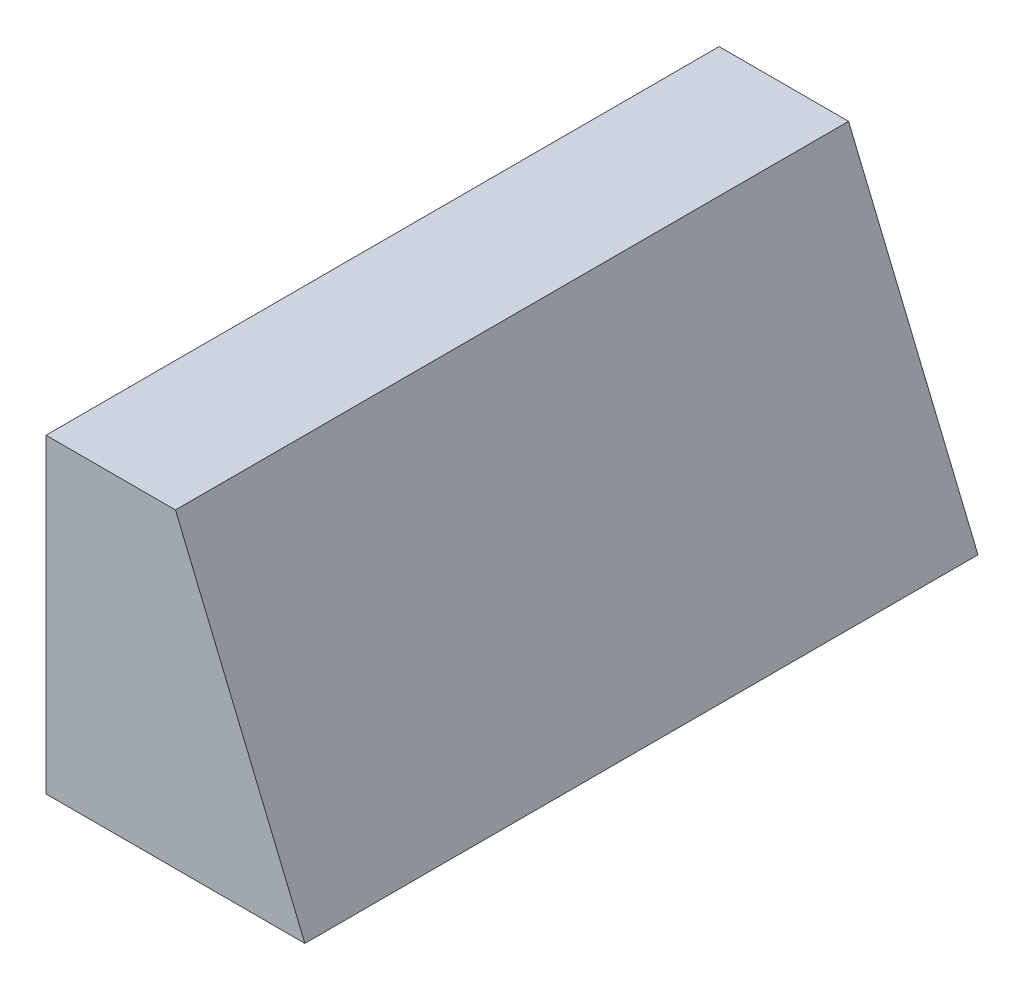
ISO-10303-21;
HEADER;
FILE_DESCRIPTION(('STEP AP214'),'2;1');
FILE_NAME('part.step','',(''),(''),'','','');
FILE_SCHEMA(('AUTOMOTIVE_DESIGN { 1 0 10303 214 1 1 1 1 }'));
ENDSEC;
DATA;
#1=APPLICATION_CONTEXT('core data for automotive mechanical design processes');
#2=APPLICATION_PROTOCOL_DEFINITION('international standard','automotive_design',2000,#1);
#3=PRODUCT_CONTEXT('',#1,'mechanical');
#4=PRODUCT('Part','Part','',(#3));
#5=PRODUCT_RELATED_PRODUCT_CATEGORY('part','',(#4));
#6=PRODUCT_DEFINITION_FORMATION('','',#4);
#7=PRODUCT_DEFINITION_CONTEXT('part definition',#1,'design');
#8=PRODUCT_DEFINITION('design','',#6,#7);
#9=PRODUCT_DEFINITION_SHAPE('','',#8);
#10=(LENGTH_UNIT() NAMED_UNIT(*) SI_UNIT(.MILLI.,.METRE.));
#11=(NAMED_UNIT(*) PLANE_ANGLE_UNIT() SI_UNIT($,.RADIAN.));
#12=(NAMED_UNIT(*) SI_UNIT($,.STERADIAN.) SOLID_ANGLE_UNIT());
#13=UNCERTAINTY_MEASURE_WITH_UNIT(LENGTH_MEASURE(1.E-05),#10,'distance_accuracy_value','');
#14=(GEOMETRIC_REPRESENTATION_CONTEXT(3) GLOBAL_UNCERTAINTY_ASSIGNED_CONTEXT((#13)) GLOBAL_UNIT_ASSIGNED_CONTEXT((#10,
#11,#12)) REPRESENTATION_CONTEXT('',''));
#15=CARTESIAN_POINT('',(0.,0.,0.));
#16=DIRECTION('',(0.,0.,1.));
#17=DIRECTION('',(1.,0.,0.));
#18=AXIS2_PLACEMENT_3D('',#15,#16,#17);
#19=CARTESIAN_POINT('',(-5.3851590106007,5.40636042402827,26.));
#20=DIRECTION('',(0.,-1.,0.));
#21=DIRECTION('',(0.,0.,-1.));
#22=AXIS2_PLACEMENT_3D('',#19,#20,#21);
#23=PLANE('',#22);
#24=DIRECTION('',(-1.,0.,0.));
#25=VECTOR('',#24,1.);
#26=CARTESIAN_POINT('',(-5.3851590106007,5.40636042402827,0.));
#27=LINE('',#26,#25);
#28=CARTESIAN_POINT('',(-0.385159010600699,5.40636042402827,0.));
#29=VERTEX_POINT('',#28);
#30=CARTESIAN_POINT('',(-5.3851590106007,5.40636042402827,0.));
#31=VERTEX_POINT('',#30);
#32=EDGE_CURVE('E97',#29,#31,#27,.T.);
#33=ORIENTED_EDGE('',*,*,#32,.T.);
#34=DIRECTION('',(0.,0.,-1.));
#35=VECTOR('',#34,1.);
#36=CARTESIAN_POINT('',(-5.3851590106007,5.40636042402827,26.));
#37=LINE('',#36,#35);
#38=CARTESIAN_POINT('',(-5.3851590106007,5.40636042402827,26.));
#39=VERTEX_POINT('',#38);
#40=EDGE_CURVE('E11',#39,#31,#37,.T.);
#41=ORIENTED_EDGE('',*,*,#40,.F.);
#42=DIRECTION('',(-1.,0.,0.));
#43=VECTOR('',#42,1.);
#44=CARTESIAN_POINT('',(-5.3851590106007,5.40636042402827,26.));
#45=LINE('',#44,#43);
#46=CARTESIAN_POINT('',(-0.385159010600699,5.40636042402827,26.));
#47=VERTEX_POINT('',#46);
#48=EDGE_CURVE('E85',#47,#39,#45,.T.);
#49=ORIENTED_EDGE('',*,*,#48,.F.);
#50=DIRECTION('',(0.,0.,-1.));
#51=VECTOR('',#50,1.);
#52=CARTESIAN_POINT('',(-0.385159010600699,5.40636042402827,26.));
#53=LINE('',#52,#51);
#54=EDGE_CURVE('E93',#47,#29,#53,.T.);
#55=ORIENTED_EDGE('',*,*,#54,.T.);
#56=EDGE_LOOP('',(#33,#41,#49,#55));
#57=FACE_BOUND('',#56,.T.);
#58=ADVANCED_FACE('F34',(#57),#23,.F.);
#59=CARTESIAN_POINT('',(-5.3851590106007,5.40636042402827,26.));
#60=DIRECTION('',(1.,0.,0.));
#61=DIRECTION('',(0.,0.,-1.));
#62=AXIS2_PLACEMENT_3D('',#59,#60,#61);
#63=PLANE('',#62);
#64=DIRECTION('',(0.,-1.,0.));
#65=VECTOR('',#64,1.);
#66=CARTESIAN_POINT('',(-5.3851590106007,5.40636042402827,0.));
#67=LINE('',#66,#65);
#68=CARTESIAN_POINT('',(-5.3851590106007,-6.59363957597173,0.));
#69=VERTEX_POINT('',#68);
#70=EDGE_CURVE('E89',#31,#69,#67,.T.);
#71=ORIENTED_EDGE('',*,*,#70,.T.);
#72=DIRECTION('',(0.,0.,-1.));
#73=VECTOR('',#72,1.);
#74=CARTESIAN_POINT('',(-5.3851590106007,-6.59363957597173,26.));
#75=LINE('',#74,#73);
#76=CARTESIAN_POINT('',(-5.3851590106007,-6.59363957597173,26.));
#77=VERTEX_POINT('',#76);
#78=EDGE_CURVE('E42',#77,#69,#75,.T.);
#79=ORIENTED_EDGE('',*,*,#78,.F.);
#80=DIRECTION('',(0.,-1.,0.));
#81=VECTOR('',#80,1.);
#82=CARTESIAN_POINT('',(-5.3851590106007,5.40636042402827,26.));
#83=LINE('',#82,#81);
#84=EDGE_CURVE('E80',#39,#77,#83,.T.);
#85=ORIENTED_EDGE('',*,*,#84,.F.);
#86=ORIENTED_EDGE('',*,*,#40,.T.);
#87=EDGE_LOOP('',(#71,#79,#85,#86));
#88=FACE_BOUND('',#87,.T.);
#89=ADVANCED_FACE('F88',(#88),#63,.F.);
#90=CARTESIAN_POINT('',(-5.3851590106007,-6.59363957597173,26.));
#91=DIRECTION('',(0.,1.,0.));
#92=DIRECTION('',(0.,0.,1.));
#93=AXIS2_PLACEMENT_3D('',#90,#91,#92);
#94=PLANE('',#93);
#95=DIRECTION('',(1.,0.,0.));
#96=VECTOR('',#95,1.);
#97=CARTESIAN_POINT('',(-5.3851590106007,-6.59363957597173,0.));
#98=LINE('',#97,#96);
#99=CARTESIAN_POINT('',(4.6148409893993,-6.59363957597173,0.));
#100=VERTEX_POINT('',#99);
#101=EDGE_CURVE('E67',#69,#100,#98,.T.);
#102=ORIENTED_EDGE('',*,*,#101,.T.);
#103=DIRECTION('',(0.,0.,-1.));
#104=VECTOR('',#103,1.);
#105=CARTESIAN_POINT('',(4.6148409893993,-6.59363957597173,26.));
#106=LINE('',#105,#104);
#107=CARTESIAN_POINT('',(4.6148409893993,-6.59363957597173,26.));
#108=VERTEX_POINT('',#107);
#109=EDGE_CURVE('E90',#108,#100,#106,.T.);
#110=ORIENTED_EDGE('',*,*,#109,.F.);
#111=DIRECTION('',(1.,0.,0.));
#112=VECTOR('',#111,1.);
#113=CARTESIAN_POINT('',(-5.3851590106007,-6.59363957597173,26.));
#114=LINE('',#113,#112);
#115=EDGE_CURVE('E83',#77,#108,#114,.T.);
#116=ORIENTED_EDGE('',*,*,#115,.F.);
#117=ORIENTED_EDGE('',*,*,#78,.T.);
#118=EDGE_LOOP('',(#102,#110,#116,#117));
#119=FACE_BOUND('',#118,.T.);
#120=ADVANCED_FACE('F91',(#119),#94,.F.);
#121=CARTESIAN_POINT('',(-0.385159010600699,5.40636042402827,26.));
#122=DIRECTION('',(-0.923076923076923,-0.384615384615385,0.));
#123=DIRECTION('',(0.384615384615385,-0.923076923076923,0.));
#124=AXIS2_PLACEMENT_3D('',#121,#122,#123);
#125=PLANE('',#124);
#126=DIRECTION('',(-0.384615384615385,0.923076923076923,0.));
#127=VECTOR('',#126,1.);
#128=CARTESIAN_POINT('',(-0.385159010600699,5.40636042402827,0.));
#129=LINE('',#128,#127);
#130=EDGE_CURVE('E73',#100,#29,#129,.T.);
#131=ORIENTED_EDGE('',*,*,#130,.T.);
#132=ORIENTED_EDGE('',*,*,#54,.F.);
#133=DIRECTION('',(-0.384615384615385,0.923076923076923,0.));
#134=VECTOR('',#133,1.);
#135=CARTESIAN_POINT('',(-0.385159010600699,5.40636042402827,26.));
#136=LINE('',#135,#134);
#137=EDGE_CURVE('E50',#108,#47,#136,.T.);
#138=ORIENTED_EDGE('',*,*,#137,.F.);
#139=ORIENTED_EDGE('',*,*,#109,.T.);
#140=EDGE_LOOP('',(#131,#132,#138,#139));
#141=FACE_BOUND('',#140,.T.);
#142=ADVANCED_FACE('F104',(#141),#125,.F.);
#143=CARTESIAN_POINT('',(0.,0.,26.));
#144=DIRECTION('',(0.,0.,-1.));
#145=DIRECTION('',(-1.,0.,0.));
#146=AXIS2_PLACEMENT_3D('',#143,#144,#145);
#147=PLANE('',#146);
#148=ORIENTED_EDGE('',*,*,#48,.T.);
#149=ORIENTED_EDGE('',*,*,#84,.T.);
#150=ORIENTED_EDGE('',*,*,#115,.T.);
#151=ORIENTED_EDGE('',*,*,#137,.T.);
#152=EDGE_LOOP('',(#148,#149,#150,#151));
#153=FACE_BOUND('',#152,.T.);
#154=ADVANCED_FACE('F81',(#153),#147,.F.);
#155=CARTESIAN_POINT('',(0.,0.,0.));
#156=DIRECTION('',(0.,0.,-1.));
#157=DIRECTION('',(-1.,0.,0.));
#158=AXIS2_PLACEMENT_3D('',#155,#156,#157);
#159=PLANE('',#158);
#160=ORIENTED_EDGE('',*,*,#32,.F.);
#161=ORIENTED_EDGE('',*,*,#130,.F.);
#162=ORIENTED_EDGE('',*,*,#101,.F.);
#163=ORIENTED_EDGE('',*,*,#70,.F.);
#164=EDGE_LOOP('',(#160,#161,#162,#163));
#165=FACE_BOUND('',#164,.T.);
#166=ADVANCED_FACE('F107',(#165),#159,.T.);
#167=CLOSED_SHELL('',(#58,#89,#120,#142,#154,#166));
#168=MANIFOLD_SOLID_BREP('B2',#167);
#169=ADVANCED_BREP_SHAPE_REPRESENTATION('',(#18,#168),#14);
#170=SHAPE_DEFINITION_REPRESENTATION(#9,#169);
ENDSEC;
END-ISO-10303-21;
